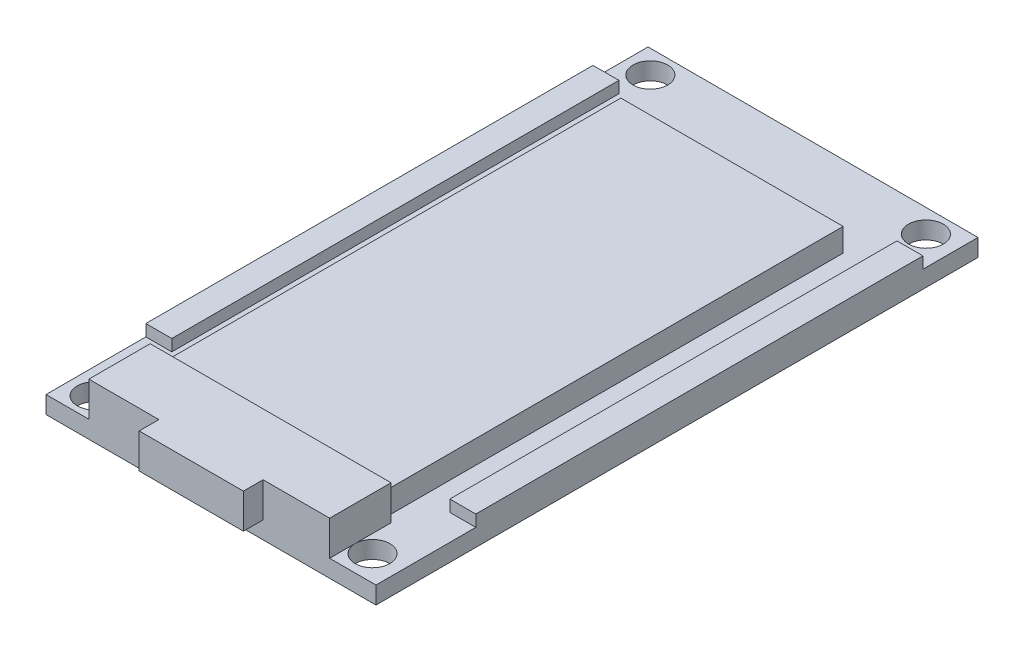
ISO-10303-21;
HEADER;
FILE_DESCRIPTION(('STEP AP214'),'2;1');
FILE_NAME('part.step','',(''),(''),'','','');
FILE_SCHEMA(('AUTOMOTIVE_DESIGN { 1 0 10303 214 1 1 1 1 }'));
ENDSEC;
DATA;
#1=APPLICATION_CONTEXT('core data for automotive mechanical design processes');
#2=APPLICATION_PROTOCOL_DEFINITION('international standard','automotive_design',2000,#1);
#3=PRODUCT_CONTEXT('',#1,'mechanical');
#4=PRODUCT('Part','Part','',(#3));
#5=PRODUCT_RELATED_PRODUCT_CATEGORY('part','',(#4));
#6=PRODUCT_DEFINITION_FORMATION('','',#4);
#7=PRODUCT_DEFINITION_CONTEXT('part definition',#1,'design');
#8=PRODUCT_DEFINITION('design','',#6,#7);
#9=PRODUCT_DEFINITION_SHAPE('','',#8);
#10=(LENGTH_UNIT() NAMED_UNIT(*) SI_UNIT(.MILLI.,.METRE.));
#11=(NAMED_UNIT(*) PLANE_ANGLE_UNIT() SI_UNIT($,.RADIAN.));
#12=(NAMED_UNIT(*) SI_UNIT($,.STERADIAN.) SOLID_ANGLE_UNIT());
#13=UNCERTAINTY_MEASURE_WITH_UNIT(LENGTH_MEASURE(1.E-05),#10,'distance_accuracy_value','');
#14=(GEOMETRIC_REPRESENTATION_CONTEXT(3) GLOBAL_UNCERTAINTY_ASSIGNED_CONTEXT((#13)) GLOBAL_UNIT_ASSIGNED_CONTEXT((#10,
#11,#12)) REPRESENTATION_CONTEXT('',''));
#15=CARTESIAN_POINT('',(0.,0.,0.));
#16=DIRECTION('',(0.,0.,1.));
#17=DIRECTION('',(1.,0.,0.));
#18=AXIS2_PLACEMENT_3D('',#15,#16,#17);
#19=CARTESIAN_POINT('',(0.,1.5,0.));
#20=DIRECTION('',(0.,1.,0.));
#21=DIRECTION('',(0.,0.,1.));
#22=AXIS2_PLACEMENT_3D('',#19,#20,#21);
#23=PLANE('',#22);
#24=DIRECTION('',(-1.,0.,0.));
#25=VECTOR('',#24,1.);
#26=CARTESIAN_POINT('',(2.24290401980517,1.5,43.3778084250648));
#27=LINE('',#26,#25);
#28=CARTESIAN_POINT('',(2.24290401980517,1.5,43.3778084250648));
#29=VERTEX_POINT('',#28);
#30=CARTESIAN_POINT('',(0.,1.5,43.3778084250648));
#31=VERTEX_POINT('',#30);
#32=EDGE_CURVE('E259',#29,#31,#27,.T.);
#33=ORIENTED_EDGE('',*,*,#32,.T.);
#34=DIRECTION('',(0.,0.,1.));
#35=VECTOR('',#34,1.);
#36=CARTESIAN_POINT('',(0.,1.5,0.));
#37=LINE('',#36,#35);
#38=CARTESIAN_POINT('',(0.,1.5,52.));
#39=VERTEX_POINT('',#38);
#40=EDGE_CURVE('E247',#31,#39,#37,.T.);
#41=ORIENTED_EDGE('',*,*,#40,.T.);
#42=DIRECTION('',(1.,0.,0.));
#43=VECTOR('',#42,1.);
#44=CARTESIAN_POINT('',(0.,1.5,52.));
#45=LINE('',#44,#43);
#46=CARTESIAN_POINT('',(3.7,1.5,52.));
#47=VERTEX_POINT('',#46);
#48=EDGE_CURVE('E428',#39,#47,#45,.T.);
#49=ORIENTED_EDGE('',*,*,#48,.T.);
#50=DIRECTION('',(0.,0.,1.));
#51=VECTOR('',#50,1.);
#52=CARTESIAN_POINT('',(3.7,1.5,46.7));
#53=LINE('',#52,#51);
#54=CARTESIAN_POINT('',(3.7,1.5,50.));
#55=VERTEX_POINT('',#54);
#56=EDGE_CURVE('E357',#55,#47,#53,.T.);
#57=ORIENTED_EDGE('',*,*,#56,.F.);
#58=CARTESIAN_POINT('',(2.2,1.5,50.));
#59=DIRECTION('',(0.,1.,0.));
#60=DIRECTION('',(0.,0.,-1.));
#61=AXIS2_PLACEMENT_3D('',#58,#59,#60);
#62=CIRCLE('',#61,1.5);
#63=EDGE_CURVE('E403',#55,#55,#62,.T.);
#64=ORIENTED_EDGE('',*,*,#63,.F.);
#65=CARTESIAN_POINT('',(3.7,1.5,46.7));
#66=VERTEX_POINT('',#65);
#67=EDGE_CURVE('E354',#66,#55,#53,.T.);
#68=ORIENTED_EDGE('',*,*,#67,.F.);
#69=DIRECTION('',(1.,0.,0.));
#70=VECTOR('',#69,1.);
#71=CARTESIAN_POINT('',(9.75,1.5,46.7));
#72=LINE('',#71,#70);
#73=CARTESIAN_POINT('',(4.65,1.5,46.7));
#74=VERTEX_POINT('',#73);
#75=EDGE_CURVE('E386',#66,#74,#72,.T.);
#76=ORIENTED_EDGE('',*,*,#75,.T.);
#77=DIRECTION('',(0.,0.,-1.));
#78=VECTOR('',#77,1.);
#79=CARTESIAN_POINT('',(4.65,1.5,46.7));
#80=LINE('',#79,#78);
#81=CARTESIAN_POINT('',(4.65,1.5,7.));
#82=VERTEX_POINT('',#81);
#83=EDGE_CURVE('E332',#74,#82,#80,.T.);
#84=ORIENTED_EDGE('',*,*,#83,.T.);
#85=DIRECTION('',(1.,0.,0.));
#86=VECTOR('',#85,1.);
#87=CARTESIAN_POINT('',(4.65,1.5,7.));
#88=LINE('',#87,#86);
#89=CARTESIAN_POINT('',(23.85,1.5,7.));
#90=VERTEX_POINT('',#89);
#91=EDGE_CURVE('E322',#82,#90,#88,.T.);
#92=ORIENTED_EDGE('',*,*,#91,.T.);
#93=DIRECTION('',(0.,0.,1.));
#94=VECTOR('',#93,1.);
#95=CARTESIAN_POINT('',(23.85,1.5,7.));
#96=LINE('',#95,#94);
#97=CARTESIAN_POINT('',(23.85,1.5,46.7));
#98=VERTEX_POINT('',#97);
#99=EDGE_CURVE('E317',#90,#98,#96,.T.);
#100=ORIENTED_EDGE('',*,*,#99,.T.);
#101=CARTESIAN_POINT('',(24.5,1.5,46.7));
#102=VERTEX_POINT('',#101);
#103=EDGE_CURVE('E82',#98,#102,#72,.T.);
#104=ORIENTED_EDGE('',*,*,#103,.T.);
#105=DIRECTION('',(0.,0.,-1.));
#106=VECTOR('',#105,1.);
#107=CARTESIAN_POINT('',(24.5,1.5,52.));
#108=LINE('',#107,#106);
#109=CARTESIAN_POINT('',(24.5,1.5,49.8));
#110=VERTEX_POINT('',#109);
#111=EDGE_CURVE('E356',#110,#102,#108,.T.);
#112=ORIENTED_EDGE('',*,*,#111,.F.);
#113=CARTESIAN_POINT('',(26.,1.5,49.8));
#114=DIRECTION('',(0.,1.,0.));
#115=DIRECTION('',(0.,0.,1.));
#116=AXIS2_PLACEMENT_3D('',#113,#114,#115);
#117=CIRCLE('',#116,1.5);
#118=EDGE_CURVE('E415',#110,#110,#117,.T.);
#119=ORIENTED_EDGE('',*,*,#118,.F.);
#120=CARTESIAN_POINT('',(24.5,1.5,52.));
#121=VERTEX_POINT('',#120);
#122=EDGE_CURVE('E365',#121,#110,#108,.T.);
#123=ORIENTED_EDGE('',*,*,#122,.F.);
#124=CARTESIAN_POINT('',(28.5,1.5,52.));
#125=VERTEX_POINT('',#124);
#126=EDGE_CURVE('E427',#121,#125,#45,.T.);
#127=ORIENTED_EDGE('',*,*,#126,.T.);
#128=DIRECTION('',(0.,0.,-1.));
#129=VECTOR('',#128,1.);
#130=CARTESIAN_POINT('',(28.5,1.5,0.));
#131=LINE('',#130,#129);
#132=CARTESIAN_POINT('',(28.5,1.5,43.3778084250648));
#133=VERTEX_POINT('',#132);
#134=EDGE_CURVE('E432',#125,#133,#131,.T.);
#135=ORIENTED_EDGE('',*,*,#134,.T.);
#136=DIRECTION('',(1.,0.,0.));
#137=VECTOR('',#136,1.);
#138=CARTESIAN_POINT('',(1.34198346334804E-13,1.5,43.3778084250649));
#139=LINE('',#138,#137);
#140=CARTESIAN_POINT('',(26.2570959801948,1.5,43.3778084250648));
#141=VERTEX_POINT('',#140);
#142=EDGE_CURVE('E292',#141,#133,#139,.T.);
#143=ORIENTED_EDGE('',*,*,#142,.F.);
#144=DIRECTION('',(0.,0.,1.));
#145=VECTOR('',#144,1.);
#146=CARTESIAN_POINT('',(26.2570959801948,1.5,0.));
#147=LINE('',#146,#145);
#148=CARTESIAN_POINT('',(26.2570959801948,1.5,4.75716758743066));
#149=VERTEX_POINT('',#148);
#150=EDGE_CURVE('E301',#149,#141,#147,.T.);
#151=ORIENTED_EDGE('',*,*,#150,.F.);
#152=DIRECTION('',(-1.,0.,0.));
#153=VECTOR('',#152,1.);
#154=CARTESIAN_POINT('',(0.,1.5,4.75716758743066));
#155=LINE('',#154,#153);
#156=CARTESIAN_POINT('',(28.5,1.5,4.75716758743066));
#157=VERTEX_POINT('',#156);
#158=EDGE_CURVE('E262',#157,#149,#155,.T.);
#159=ORIENTED_EDGE('',*,*,#158,.F.);
#160=CARTESIAN_POINT('',(28.5,1.5,0.));
#161=VERTEX_POINT('',#160);
#162=EDGE_CURVE('E430',#157,#161,#131,.T.);
#163=ORIENTED_EDGE('',*,*,#162,.T.);
#164=DIRECTION('',(-1.,0.,0.));
#165=VECTOR('',#164,1.);
#166=CARTESIAN_POINT('',(0.,1.5,0.));
#167=LINE('',#166,#165);
#168=CARTESIAN_POINT('',(0.,1.5,0.));
#169=VERTEX_POINT('',#168);
#170=EDGE_CURVE('E434',#161,#169,#167,.T.);
#171=ORIENTED_EDGE('',*,*,#170,.T.);
#172=CARTESIAN_POINT('',(0.,1.5,4.75716758743066));
#173=VERTEX_POINT('',#172);
#174=EDGE_CURVE('E255',#169,#173,#37,.T.);
#175=ORIENTED_EDGE('',*,*,#174,.T.);
#176=DIRECTION('',(1.,0.,0.));
#177=VECTOR('',#176,1.);
#178=CARTESIAN_POINT('',(0.,1.5,4.75716758743066));
#179=LINE('',#178,#177);
#180=CARTESIAN_POINT('',(2.24290401980517,1.5,4.75716758743066));
#181=VERTEX_POINT('',#180);
#182=EDGE_CURVE('E101',#173,#181,#179,.T.);
#183=ORIENTED_EDGE('',*,*,#182,.T.);
#184=DIRECTION('',(0.,0.,1.));
#185=VECTOR('',#184,1.);
#186=CARTESIAN_POINT('',(2.24290401980517,1.5,4.75716758743066));
#187=LINE('',#186,#185);
#188=EDGE_CURVE('E96',#181,#29,#187,.T.);
#189=ORIENTED_EDGE('',*,*,#188,.T.);
#190=EDGE_LOOP('',(#33,#41,#49,#57,#64,#68,#76,#84,#92,#100,#104,#112,#119,#123,#127,#135,#143,
#151,#159,#163,#171,#175,#183,#189));
#191=FACE_BOUND('',#190,.T.);
#192=CARTESIAN_POINT('',(2.2,1.5,2.));
#193=DIRECTION('',(0.,1.,0.));
#194=DIRECTION('',(0.,0.,1.));
#195=AXIS2_PLACEMENT_3D('',#192,#193,#194);
#196=CIRCLE('',#195,1.5);
#197=CARTESIAN_POINT('',(2.2,1.5,3.5));
#198=VERTEX_POINT('',#197);
#199=EDGE_CURVE('E409',#198,#198,#196,.T.);
#200=ORIENTED_EDGE('',*,*,#199,.F.);
#201=EDGE_LOOP('',(#200));
#202=FACE_BOUND('',#201,.T.);
#203=CARTESIAN_POINT('',(26.,1.5,2.));
#204=DIRECTION('',(0.,1.,0.));
#205=DIRECTION('',(0.,0.,1.));
#206=AXIS2_PLACEMENT_3D('',#203,#204,#205);
#207=CIRCLE('',#206,1.5);
#208=CARTESIAN_POINT('',(26.,1.5,3.5));
#209=VERTEX_POINT('',#208);
#210=EDGE_CURVE('E421',#209,#209,#207,.T.);
#211=ORIENTED_EDGE('',*,*,#210,.F.);
#212=EDGE_LOOP('',(#211));
#213=FACE_BOUND('',#212,.T.);
#214=ADVANCED_FACE('F78',(#191,#202,#213),#23,.T.);
#215=CARTESIAN_POINT('',(9.75,1.5,46.7));
#216=DIRECTION('',(1.,0.,0.));
#217=DIRECTION('',(0.,0.,-1.));
#218=AXIS2_PLACEMENT_3D('',#215,#216,#217);
#219=PLANE('',#218);
#220=DIRECTION('',(0.,-1.,0.));
#221=VECTOR('',#220,1.);
#222=CARTESIAN_POINT('',(9.75,4.5,52.));
#223=LINE('',#222,#221);
#224=CARTESIAN_POINT('',(9.75,4.5,52.));
#225=VERTEX_POINT('',#224);
#226=CARTESIAN_POINT('',(9.75,1.5,52.));
#227=VERTEX_POINT('',#226);
#228=EDGE_CURVE('E338',#225,#227,#223,.T.);
#229=ORIENTED_EDGE('',*,*,#228,.T.);
#230=DIRECTION('',(0.,0.,-1.));
#231=VECTOR('',#230,1.);
#232=CARTESIAN_POINT('',(9.75,1.5,46.7));
#233=LINE('',#232,#231);
#234=CARTESIAN_POINT('',(9.75,1.5,53.7));
#235=VERTEX_POINT('',#234);
#236=EDGE_CURVE('E379',#235,#227,#233,.T.);
#237=ORIENTED_EDGE('',*,*,#236,.F.);
#238=DIRECTION('',(0.,1.,0.));
#239=VECTOR('',#238,1.);
#240=CARTESIAN_POINT('',(9.75,1.5,53.7));
#241=LINE('',#240,#239);
#242=CARTESIAN_POINT('',(9.75,4.5,53.7));
#243=VERTEX_POINT('',#242);
#244=EDGE_CURVE('E383',#235,#243,#241,.T.);
#245=ORIENTED_EDGE('',*,*,#244,.T.);
#246=DIRECTION('',(0.,0.,-1.));
#247=VECTOR('',#246,1.);
#248=CARTESIAN_POINT('',(9.75,4.5,46.7));
#249=LINE('',#248,#247);
#250=EDGE_CURVE('E378',#243,#225,#249,.T.);
#251=ORIENTED_EDGE('',*,*,#250,.T.);
#252=EDGE_LOOP('',(#229,#237,#245,#251));
#253=FACE_BOUND('',#252,.T.);
#254=ADVANCED_FACE('F472',(#253),#219,.F.);
#255=CARTESIAN_POINT('',(18.75,1.5,46.7));
#256=DIRECTION('',(-1.,0.,0.));
#257=DIRECTION('',(0.,0.,1.));
#258=AXIS2_PLACEMENT_3D('',#255,#256,#257);
#259=PLANE('',#258);
#260=DIRECTION('',(0.,-1.,0.));
#261=VECTOR('',#260,1.);
#262=CARTESIAN_POINT('',(18.75,4.5,52.));
#263=LINE('',#262,#261);
#264=CARTESIAN_POINT('',(18.75,4.5,52.));
#265=VERTEX_POINT('',#264);
#266=CARTESIAN_POINT('',(18.75,1.5,52.));
#267=VERTEX_POINT('',#266);
#268=EDGE_CURVE('E372',#265,#267,#263,.T.);
#269=ORIENTED_EDGE('',*,*,#268,.F.);
#270=DIRECTION('',(0.,0.,1.));
#271=VECTOR('',#270,1.);
#272=CARTESIAN_POINT('',(18.75,4.5,46.7));
#273=LINE('',#272,#271);
#274=CARTESIAN_POINT('',(18.75,4.5,53.7));
#275=VERTEX_POINT('',#274);
#276=EDGE_CURVE('E400',#265,#275,#273,.T.);
#277=ORIENTED_EDGE('',*,*,#276,.T.);
#278=DIRECTION('',(0.,1.,0.));
#279=VECTOR('',#278,1.);
#280=CARTESIAN_POINT('',(18.75,1.5,53.7));
#281=LINE('',#280,#279);
#282=CARTESIAN_POINT('',(18.75,1.5,53.7));
#283=VERTEX_POINT('',#282);
#284=EDGE_CURVE('E456',#283,#275,#281,.T.);
#285=ORIENTED_EDGE('',*,*,#284,.F.);
#286=DIRECTION('',(0.,0.,1.));
#287=VECTOR('',#286,1.);
#288=CARTESIAN_POINT('',(18.75,1.5,46.7));
#289=LINE('',#288,#287);
#290=EDGE_CURVE('E396',#267,#283,#289,.T.);
#291=ORIENTED_EDGE('',*,*,#290,.F.);
#292=EDGE_LOOP('',(#269,#277,#285,#291));
#293=FACE_BOUND('',#292,.T.);
#294=ADVANCED_FACE('F540',(#293),#259,.F.);
#295=CARTESIAN_POINT('',(0.,0.,0.));
#296=DIRECTION('',(0.,1.,0.));
#297=DIRECTION('',(0.,0.,1.));
#298=AXIS2_PLACEMENT_3D('',#295,#296,#297);
#299=PLANE('',#298);
#300=DIRECTION('',(0.,0.,1.));
#301=VECTOR('',#300,1.);
#302=CARTESIAN_POINT('',(0.,0.,0.));
#303=LINE('',#302,#301);
#304=CARTESIAN_POINT('',(0.,0.,0.));
#305=VERTEX_POINT('',#304);
#306=CARTESIAN_POINT('',(0.,0.,52.));
#307=VERTEX_POINT('',#306);
#308=EDGE_CURVE('E424',#305,#307,#303,.T.);
#309=ORIENTED_EDGE('',*,*,#308,.F.);
#310=DIRECTION('',(-1.,0.,0.));
#311=VECTOR('',#310,1.);
#312=CARTESIAN_POINT('',(0.,0.,0.));
#313=LINE('',#312,#311);
#314=CARTESIAN_POINT('',(28.5,0.,0.));
#315=VERTEX_POINT('',#314);
#316=EDGE_CURVE('E256',#315,#305,#313,.T.);
#317=ORIENTED_EDGE('',*,*,#316,.F.);
#318=DIRECTION('',(0.,0.,-1.));
#319=VECTOR('',#318,1.);
#320=CARTESIAN_POINT('',(28.5,0.,0.));
#321=LINE('',#320,#319);
#322=CARTESIAN_POINT('',(28.5,0.,52.));
#323=VERTEX_POINT('',#322);
#324=EDGE_CURVE('E440',#323,#315,#321,.T.);
#325=ORIENTED_EDGE('',*,*,#324,.F.);
#326=DIRECTION('',(1.,0.,0.));
#327=VECTOR('',#326,1.);
#328=CARTESIAN_POINT('',(0.,0.,52.));
#329=LINE('',#328,#327);
#330=EDGE_CURVE('E438',#307,#323,#329,.T.);
#331=ORIENTED_EDGE('',*,*,#330,.F.);
#332=EDGE_LOOP('',(#309,#317,#325,#331));
#333=FACE_BOUND('',#332,.T.);
#334=CARTESIAN_POINT('',(26.,0.,2.));
#335=DIRECTION('',(0.,1.,0.));
#336=DIRECTION('',(0.,0.,1.));
#337=AXIS2_PLACEMENT_3D('',#334,#335,#336);
#338=CIRCLE('',#337,1.5);
#339=CARTESIAN_POINT('',(26.,0.,3.5));
#340=VERTEX_POINT('',#339);
#341=EDGE_CURVE('E418',#340,#340,#338,.T.);
#342=ORIENTED_EDGE('',*,*,#341,.T.);
#343=EDGE_LOOP('',(#342));
#344=FACE_BOUND('',#343,.T.);
#345=CARTESIAN_POINT('',(26.,0.,49.8));
#346=DIRECTION('',(0.,1.,0.));
#347=DIRECTION('',(0.,0.,1.));
#348=AXIS2_PLACEMENT_3D('',#345,#346,#347);
#349=CIRCLE('',#348,1.5);
#350=CARTESIAN_POINT('',(26.,0.,51.3));
#351=VERTEX_POINT('',#350);
#352=EDGE_CURVE('E412',#351,#351,#349,.T.);
#353=ORIENTED_EDGE('',*,*,#352,.T.);
#354=EDGE_LOOP('',(#353));
#355=FACE_BOUND('',#354,.T.);
#356=CARTESIAN_POINT('',(2.2,0.,2.));
#357=DIRECTION('',(0.,1.,0.));
#358=DIRECTION('',(0.,0.,1.));
#359=AXIS2_PLACEMENT_3D('',#356,#357,#358);
#360=CIRCLE('',#359,1.5);
#361=CARTESIAN_POINT('',(2.2,0.,3.5));
#362=VERTEX_POINT('',#361);
#363=EDGE_CURVE('E406',#362,#362,#360,.T.);
#364=ORIENTED_EDGE('',*,*,#363,.T.);
#365=EDGE_LOOP('',(#364));
#366=FACE_BOUND('',#365,.T.);
#367=CARTESIAN_POINT('',(2.2,0.,50.));
#368=DIRECTION('',(0.,1.,0.));
#369=DIRECTION('',(0.,0.,-1.));
#370=AXIS2_PLACEMENT_3D('',#367,#368,#369);
#371=CIRCLE('',#370,1.5);
#372=CARTESIAN_POINT('',(2.2,0.,48.5));
#373=VERTEX_POINT('',#372);
#374=EDGE_CURVE('E388',#373,#373,#371,.T.);
#375=ORIENTED_EDGE('',*,*,#374,.T.);
#376=EDGE_LOOP('',(#375));
#377=FACE_BOUND('',#376,.T.);
#378=ADVANCED_FACE('F546',(#333,#344,#355,#366,#377),#299,.F.);
#379=CARTESIAN_POINT('',(0.,1.5,0.));
#380=DIRECTION('',(1.,0.,0.));
#381=DIRECTION('',(0.,0.,-1.));
#382=AXIS2_PLACEMENT_3D('',#379,#380,#381);
#383=PLANE('',#382);
#384=ORIENTED_EDGE('',*,*,#308,.T.);
#385=DIRECTION('',(0.,-1.,0.));
#386=VECTOR('',#385,1.);
#387=CARTESIAN_POINT('',(0.,1.5,52.));
#388=LINE('',#387,#386);
#389=EDGE_CURVE('E12',#39,#307,#388,.T.);
#390=ORIENTED_EDGE('',*,*,#389,.F.);
#391=ORIENTED_EDGE('',*,*,#40,.F.);
#392=DIRECTION('',(0.,-1.,0.));
#393=VECTOR('',#392,1.);
#394=CARTESIAN_POINT('',(0.,2.5,43.3778084250648));
#395=LINE('',#394,#393);
#396=CARTESIAN_POINT('',(0.,2.5,43.3778084250648));
#397=VERTEX_POINT('',#396);
#398=EDGE_CURVE('E251',#397,#31,#395,.T.);
#399=ORIENTED_EDGE('',*,*,#398,.F.);
#400=DIRECTION('',(0.,0.,-1.));
#401=VECTOR('',#400,1.);
#402=CARTESIAN_POINT('',(0.,2.5,43.3778084250648));
#403=LINE('',#402,#401);
#404=CARTESIAN_POINT('',(0.,2.5,4.75716758743066));
#405=VERTEX_POINT('',#404);
#406=EDGE_CURVE('E285',#397,#405,#403,.T.);
#407=ORIENTED_EDGE('',*,*,#406,.T.);
#408=DIRECTION('',(0.,-1.,0.));
#409=VECTOR('',#408,1.);
#410=CARTESIAN_POINT('',(0.,2.5,4.75716758743066));
#411=LINE('',#410,#409);
#412=EDGE_CURVE('E269',#405,#173,#411,.T.);
#413=ORIENTED_EDGE('',*,*,#412,.T.);
#414=ORIENTED_EDGE('',*,*,#174,.F.);
#415=DIRECTION('',(0.,-1.,0.));
#416=VECTOR('',#415,1.);
#417=CARTESIAN_POINT('',(0.,1.5,0.));
#418=LINE('',#417,#416);
#419=EDGE_CURVE('E436',#169,#305,#418,.T.);
#420=ORIENTED_EDGE('',*,*,#419,.T.);
#421=EDGE_LOOP('',(#384,#390,#391,#399,#407,#413,#414,#420));
#422=FACE_BOUND('',#421,.T.);
#423=ADVANCED_FACE('F80',(#422),#383,.F.);
#424=CARTESIAN_POINT('',(0.,1.5,52.));
#425=DIRECTION('',(0.,0.,-1.));
#426=DIRECTION('',(-1.,0.,0.));
#427=AXIS2_PLACEMENT_3D('',#424,#425,#426);
#428=PLANE('',#427);
#429=ORIENTED_EDGE('',*,*,#330,.T.);
#430=DIRECTION('',(0.,-1.,0.));
#431=VECTOR('',#430,1.);
#432=CARTESIAN_POINT('',(28.5,1.5,52.));
#433=LINE('',#432,#431);
#434=EDGE_CURVE('E88',#125,#323,#433,.T.);
#435=ORIENTED_EDGE('',*,*,#434,.F.);
#436=ORIENTED_EDGE('',*,*,#126,.F.);
#437=DIRECTION('',(0.,-1.,0.));
#438=VECTOR('',#437,1.);
#439=CARTESIAN_POINT('',(24.5,4.5,52.));
#440=LINE('',#439,#438);
#441=CARTESIAN_POINT('',(24.5,4.5,52.));
#442=VERTEX_POINT('',#441);
#443=EDGE_CURVE('E367',#442,#121,#440,.T.);
#444=ORIENTED_EDGE('',*,*,#443,.F.);
#445=DIRECTION('',(1.,0.,0.));
#446=VECTOR('',#445,1.);
#447=CARTESIAN_POINT('',(18.75,4.5,52.));
#448=LINE('',#447,#446);
#449=EDGE_CURVE('E364',#265,#442,#448,.T.);
#450=ORIENTED_EDGE('',*,*,#449,.F.);
#451=ORIENTED_EDGE('',*,*,#268,.T.);
#452=EDGE_CURVE('E431',#227,#267,#45,.T.);
#453=ORIENTED_EDGE('',*,*,#452,.F.);
#454=ORIENTED_EDGE('',*,*,#228,.F.);
#455=DIRECTION('',(1.,0.,0.));
#456=VECTOR('',#455,1.);
#457=CARTESIAN_POINT('',(3.7,4.5,52.));
#458=LINE('',#457,#456);
#459=CARTESIAN_POINT('',(3.7,4.5,52.));
#460=VERTEX_POINT('',#459);
#461=EDGE_CURVE('E359',#460,#225,#458,.T.);
#462=ORIENTED_EDGE('',*,*,#461,.F.);
#463=DIRECTION('',(0.,-1.,0.));
#464=VECTOR('',#463,1.);
#465=CARTESIAN_POINT('',(3.7,4.5,52.));
#466=LINE('',#465,#464);
#467=EDGE_CURVE('E350',#460,#47,#466,.T.);
#468=ORIENTED_EDGE('',*,*,#467,.T.);
#469=ORIENTED_EDGE('',*,*,#48,.F.);
#470=ORIENTED_EDGE('',*,*,#389,.T.);
#471=EDGE_LOOP('',(#429,#435,#436,#444,#450,#451,#453,#454,#462,#468,#469,#470));
#472=FACE_BOUND('',#471,.T.);
#473=ADVANCED_FACE('F483',(#472),#428,.F.);
#474=CARTESIAN_POINT('',(28.5,1.5,0.));
#475=DIRECTION('',(-1.,0.,0.));
#476=DIRECTION('',(0.,0.,1.));
#477=AXIS2_PLACEMENT_3D('',#474,#475,#476);
#478=PLANE('',#477);
#479=ORIENTED_EDGE('',*,*,#324,.T.);
#480=DIRECTION('',(0.,-1.,0.));
#481=VECTOR('',#480,1.);
#482=CARTESIAN_POINT('',(28.5,1.5,0.));
#483=LINE('',#482,#481);
#484=EDGE_CURVE('E445',#161,#315,#483,.T.);
#485=ORIENTED_EDGE('',*,*,#484,.F.);
#486=ORIENTED_EDGE('',*,*,#162,.F.);
#487=DIRECTION('',(0.,-1.,0.));
#488=VECTOR('',#487,1.);
#489=CARTESIAN_POINT('',(28.5,2.5,4.75716758743066));
#490=LINE('',#489,#488);
#491=CARTESIAN_POINT('',(28.5,2.5,4.75716758743066));
#492=VERTEX_POINT('',#491);
#493=EDGE_CURVE('E314',#492,#157,#490,.T.);
#494=ORIENTED_EDGE('',*,*,#493,.F.);
#495=DIRECTION('',(0.,0.,-1.));
#496=VECTOR('',#495,1.);
#497=CARTESIAN_POINT('',(28.5,2.5,0.));
#498=LINE('',#497,#496);
#499=CARTESIAN_POINT('',(28.5,2.5,43.3778084250648));
#500=VERTEX_POINT('',#499);
#501=EDGE_CURVE('E288',#500,#492,#498,.T.);
#502=ORIENTED_EDGE('',*,*,#501,.F.);
#503=DIRECTION('',(0.,-1.,0.));
#504=VECTOR('',#503,1.);
#505=CARTESIAN_POINT('',(28.5,2.5,43.3778084250648));
#506=LINE('',#505,#504);
#507=EDGE_CURVE('E298',#500,#133,#506,.T.);
#508=ORIENTED_EDGE('',*,*,#507,.T.);
#509=ORIENTED_EDGE('',*,*,#134,.F.);
#510=ORIENTED_EDGE('',*,*,#434,.T.);
#511=EDGE_LOOP('',(#479,#485,#486,#494,#502,#508,#509,#510));
#512=FACE_BOUND('',#511,.T.);
#513=ADVANCED_FACE('F494',(#512),#478,.F.);
#514=CARTESIAN_POINT('',(0.,1.5,0.));
#515=DIRECTION('',(0.,0.,1.));
#516=DIRECTION('',(1.,0.,0.));
#517=AXIS2_PLACEMENT_3D('',#514,#515,#516);
#518=PLANE('',#517);
#519=ORIENTED_EDGE('',*,*,#316,.T.);
#520=ORIENTED_EDGE('',*,*,#419,.F.);
#521=ORIENTED_EDGE('',*,*,#170,.F.);
#522=ORIENTED_EDGE('',*,*,#484,.T.);
#523=EDGE_LOOP('',(#519,#520,#521,#522));
#524=FACE_BOUND('',#523,.T.);
#525=ADVANCED_FACE('F514',(#524),#518,.F.);
#526=CARTESIAN_POINT('',(26.,1.5,2.));
#527=DIRECTION('',(0.,-1.,0.));
#528=DIRECTION('',(0.,0.,-1.));
#529=AXIS2_PLACEMENT_3D('',#526,#527,#528);
#530=CYLINDRICAL_SURFACE('',#529,1.5);
#531=ORIENTED_EDGE('',*,*,#210,.T.);
#532=EDGE_LOOP('',(#531));
#533=FACE_BOUND('',#532,.T.);
#534=ORIENTED_EDGE('',*,*,#341,.F.);
#535=EDGE_LOOP('',(#534));
#536=FACE_BOUND('',#535,.T.);
#537=ADVANCED_FACE('F544',(#533,#536),#530,.F.);
#538=CARTESIAN_POINT('',(26.,1.5,49.8));
#539=DIRECTION('',(0.,-1.,0.));
#540=DIRECTION('',(0.,0.,-1.));
#541=AXIS2_PLACEMENT_3D('',#538,#539,#540);
#542=CYLINDRICAL_SURFACE('',#541,1.5);
#543=ORIENTED_EDGE('',*,*,#118,.T.);
#544=EDGE_LOOP('',(#543));
#545=FACE_BOUND('',#544,.T.);
#546=ORIENTED_EDGE('',*,*,#352,.F.);
#547=EDGE_LOOP('',(#546));
#548=FACE_BOUND('',#547,.T.);
#549=ADVANCED_FACE('F749',(#545,#548),#542,.F.);
#550=CARTESIAN_POINT('',(2.2,1.5,2.));
#551=DIRECTION('',(0.,-1.,0.));
#552=DIRECTION('',(0.,0.,-1.));
#553=AXIS2_PLACEMENT_3D('',#550,#551,#552);
#554=CYLINDRICAL_SURFACE('',#553,1.5);
#555=ORIENTED_EDGE('',*,*,#199,.T.);
#556=EDGE_LOOP('',(#555));
#557=FACE_BOUND('',#556,.T.);
#558=ORIENTED_EDGE('',*,*,#363,.F.);
#559=EDGE_LOOP('',(#558));
#560=FACE_BOUND('',#559,.T.);
#561=ADVANCED_FACE('F740',(#557,#560),#554,.F.);
#562=CARTESIAN_POINT('',(2.2,1.5,50.));
#563=DIRECTION('',(0.,-1.,0.));
#564=DIRECTION('',(0.,0.,-1.));
#565=AXIS2_PLACEMENT_3D('',#562,#563,#564);
#566=CYLINDRICAL_SURFACE('',#565,1.5);
#567=ORIENTED_EDGE('',*,*,#63,.T.);
#568=EDGE_LOOP('',(#567));
#569=FACE_BOUND('',#568,.T.);
#570=ORIENTED_EDGE('',*,*,#374,.F.);
#571=EDGE_LOOP('',(#570));
#572=FACE_BOUND('',#571,.T.);
#573=ADVANCED_FACE('F709',(#569,#572),#566,.F.);
#574=CARTESIAN_POINT('',(0.,4.5,0.));
#575=DIRECTION('',(0.,-1.,0.));
#576=DIRECTION('',(0.,0.,-1.));
#577=AXIS2_PLACEMENT_3D('',#574,#575,#576);
#578=PLANE('',#577);
#579=ORIENTED_EDGE('',*,*,#250,.F.);
#580=DIRECTION('',(-1.,0.,0.));
#581=VECTOR('',#580,1.);
#582=CARTESIAN_POINT('',(9.75,4.5,53.7));
#583=LINE('',#582,#581);
#584=EDGE_CURVE('E382',#275,#243,#583,.T.);
#585=ORIENTED_EDGE('',*,*,#584,.F.);
#586=ORIENTED_EDGE('',*,*,#276,.F.);
#587=ORIENTED_EDGE('',*,*,#449,.T.);
#588=DIRECTION('',(0.,0.,-1.));
#589=VECTOR('',#588,1.);
#590=CARTESIAN_POINT('',(24.5,4.5,52.));
#591=LINE('',#590,#589);
#592=CARTESIAN_POINT('',(24.5,4.5,46.7));
#593=VERTEX_POINT('',#592);
#594=EDGE_CURVE('E361',#442,#593,#591,.T.);
#595=ORIENTED_EDGE('',*,*,#594,.T.);
#596=DIRECTION('',(1.,0.,0.));
#597=VECTOR('',#596,1.);
#598=CARTESIAN_POINT('',(9.75,4.5,46.7));
#599=LINE('',#598,#597);
#600=CARTESIAN_POINT('',(3.7,4.5,46.7));
#601=VERTEX_POINT('',#600);
#602=EDGE_CURVE('E399',#601,#593,#599,.T.);
#603=ORIENTED_EDGE('',*,*,#602,.F.);
#604=DIRECTION('',(0.,0.,1.));
#605=VECTOR('',#604,1.);
#606=CARTESIAN_POINT('',(3.7,4.5,46.7));
#607=LINE('',#606,#605);
#608=EDGE_CURVE('E353',#601,#460,#607,.T.);
#609=ORIENTED_EDGE('',*,*,#608,.T.);
#610=ORIENTED_EDGE('',*,*,#461,.T.);
#611=EDGE_LOOP('',(#579,#585,#586,#587,#595,#603,#609,#610));
#612=FACE_BOUND('',#611,.T.);
#613=ADVANCED_FACE('F476',(#612),#578,.F.);
#614=CARTESIAN_POINT('',(0.,1.5,0.));
#615=DIRECTION('',(0.,-1.,0.));
#616=DIRECTION('',(0.,0.,-1.));
#617=AXIS2_PLACEMENT_3D('',#614,#615,#616);
#618=PLANE('',#617);
#619=ORIENTED_EDGE('',*,*,#236,.T.);
#620=ORIENTED_EDGE('',*,*,#452,.T.);
#621=ORIENTED_EDGE('',*,*,#290,.T.);
#622=DIRECTION('',(-1.,0.,0.));
#623=VECTOR('',#622,1.);
#624=CARTESIAN_POINT('',(9.75,1.5,53.7));
#625=LINE('',#624,#623);
#626=EDGE_CURVE('E450',#283,#235,#625,.T.);
#627=ORIENTED_EDGE('',*,*,#626,.T.);
#628=EDGE_LOOP('',(#619,#620,#621,#627));
#629=FACE_BOUND('',#628,.T.);
#630=ADVANCED_FACE('F716',(#629),#618,.T.);
#631=CARTESIAN_POINT('',(9.75,1.5,53.7));
#632=DIRECTION('',(0.,0.,-1.));
#633=DIRECTION('',(-1.,0.,0.));
#634=AXIS2_PLACEMENT_3D('',#631,#632,#633);
#635=PLANE('',#634);
#636=ORIENTED_EDGE('',*,*,#584,.T.);
#637=ORIENTED_EDGE('',*,*,#244,.F.);
#638=ORIENTED_EDGE('',*,*,#626,.F.);
#639=ORIENTED_EDGE('',*,*,#284,.T.);
#640=EDGE_LOOP('',(#636,#637,#638,#639));
#641=FACE_BOUND('',#640,.T.);
#642=ADVANCED_FACE('F706',(#641),#635,.F.);
#643=CARTESIAN_POINT('',(9.75,1.5,46.7));
#644=DIRECTION('',(0.,0.,1.));
#645=DIRECTION('',(1.,0.,0.));
#646=AXIS2_PLACEMENT_3D('',#643,#644,#645);
#647=PLANE('',#646);
#648=ORIENTED_EDGE('',*,*,#103,.F.);
#649=DIRECTION('',(0.,-1.,0.));
#650=VECTOR('',#649,1.);
#651=CARTESIAN_POINT('',(23.85,3.5,46.7));
#652=LINE('',#651,#650);
#653=CARTESIAN_POINT('',(23.85,3.5,46.7));
#654=VERTEX_POINT('',#653);
#655=EDGE_CURVE('E330',#654,#98,#652,.T.);
#656=ORIENTED_EDGE('',*,*,#655,.F.);
#657=DIRECTION('',(-1.,0.,0.));
#658=VECTOR('',#657,1.);
#659=CARTESIAN_POINT('',(23.85,3.5,46.7));
#660=LINE('',#659,#658);
#661=CARTESIAN_POINT('',(4.65,3.5,46.7));
#662=VERTEX_POINT('',#661);
#663=EDGE_CURVE('E321',#654,#662,#660,.T.);
#664=ORIENTED_EDGE('',*,*,#663,.T.);
#665=DIRECTION('',(0.,-1.,0.));
#666=VECTOR('',#665,1.);
#667=CARTESIAN_POINT('',(4.65,3.5,46.7));
#668=LINE('',#667,#666);
#669=EDGE_CURVE('E342',#662,#74,#668,.T.);
#670=ORIENTED_EDGE('',*,*,#669,.T.);
#671=ORIENTED_EDGE('',*,*,#75,.F.);
#672=DIRECTION('',(0.,-1.,0.));
#673=VECTOR('',#672,1.);
#674=CARTESIAN_POINT('',(3.7,4.5,46.7));
#675=LINE('',#674,#673);
#676=EDGE_CURVE('E347',#601,#66,#675,.T.);
#677=ORIENTED_EDGE('',*,*,#676,.F.);
#678=ORIENTED_EDGE('',*,*,#602,.T.);
#679=DIRECTION('',(0.,-1.,0.));
#680=VECTOR('',#679,1.);
#681=CARTESIAN_POINT('',(24.5,4.5,46.7));
#682=LINE('',#681,#680);
#683=EDGE_CURVE('E375',#593,#102,#682,.T.);
#684=ORIENTED_EDGE('',*,*,#683,.T.);
#685=EDGE_LOOP('',(#648,#656,#664,#670,#671,#677,#678,#684));
#686=FACE_BOUND('',#685,.T.);
#687=ADVANCED_FACE('F680',(#686),#647,.F.);
#688=CARTESIAN_POINT('',(24.5,4.5,52.));
#689=DIRECTION('',(-1.,0.,0.));
#690=DIRECTION('',(0.,0.,1.));
#691=AXIS2_PLACEMENT_3D('',#688,#689,#690);
#692=PLANE('',#691);
#693=ORIENTED_EDGE('',*,*,#122,.T.);
#694=ORIENTED_EDGE('',*,*,#111,.T.);
#695=ORIENTED_EDGE('',*,*,#683,.F.);
#696=ORIENTED_EDGE('',*,*,#594,.F.);
#697=ORIENTED_EDGE('',*,*,#443,.T.);
#698=EDGE_LOOP('',(#693,#694,#695,#696,#697));
#699=FACE_BOUND('',#698,.T.);
#700=ADVANCED_FACE('F671',(#699),#692,.F.);
#701=CARTESIAN_POINT('',(3.7,4.5,46.7));
#702=DIRECTION('',(1.,0.,0.));
#703=DIRECTION('',(0.,0.,-1.));
#704=AXIS2_PLACEMENT_3D('',#701,#702,#703);
#705=PLANE('',#704);
#706=ORIENTED_EDGE('',*,*,#67,.T.);
#707=ORIENTED_EDGE('',*,*,#56,.T.);
#708=ORIENTED_EDGE('',*,*,#467,.F.);
#709=ORIENTED_EDGE('',*,*,#608,.F.);
#710=ORIENTED_EDGE('',*,*,#676,.T.);
#711=EDGE_LOOP('',(#706,#707,#708,#709,#710));
#712=FACE_BOUND('',#711,.T.);
#713=ADVANCED_FACE('F662',(#712),#705,.F.);
#714=CARTESIAN_POINT('',(23.85,3.5,7.));
#715=DIRECTION('',(1.,0.,0.));
#716=DIRECTION('',(0.,0.,-1.));
#717=AXIS2_PLACEMENT_3D('',#714,#715,#716);
#718=PLANE('',#717);
#719=ORIENTED_EDGE('',*,*,#99,.F.);
#720=DIRECTION('',(0.,-1.,0.));
#721=VECTOR('',#720,1.);
#722=CARTESIAN_POINT('',(23.85,3.5,7.));
#723=LINE('',#722,#721);
#724=CARTESIAN_POINT('',(23.85,3.5,7.));
#725=VERTEX_POINT('',#724);
#726=EDGE_CURVE('E335',#725,#90,#723,.T.);
#727=ORIENTED_EDGE('',*,*,#726,.F.);
#728=DIRECTION('',(0.,0.,1.));
#729=VECTOR('',#728,1.);
#730=CARTESIAN_POINT('',(23.85,3.5,7.));
#731=LINE('',#730,#729);
#732=EDGE_CURVE('E318',#725,#654,#731,.T.);
#733=ORIENTED_EDGE('',*,*,#732,.T.);
#734=ORIENTED_EDGE('',*,*,#655,.T.);
#735=EDGE_LOOP('',(#719,#727,#733,#734));
#736=FACE_BOUND('',#735,.T.);
#737=ADVANCED_FACE('F653',(#736),#718,.T.);
#738=CARTESIAN_POINT('',(4.65,3.5,7.));
#739=DIRECTION('',(0.,0.,-1.));
#740=DIRECTION('',(-1.,0.,0.));
#741=AXIS2_PLACEMENT_3D('',#738,#739,#740);
#742=PLANE('',#741);
#743=ORIENTED_EDGE('',*,*,#91,.F.);
#744=DIRECTION('',(0.,-1.,0.));
#745=VECTOR('',#744,1.);
#746=CARTESIAN_POINT('',(4.65,3.5,7.));
#747=LINE('',#746,#745);
#748=CARTESIAN_POINT('',(4.65,3.5,7.));
#749=VERTEX_POINT('',#748);
#750=EDGE_CURVE('E339',#749,#82,#747,.T.);
#751=ORIENTED_EDGE('',*,*,#750,.F.);
#752=DIRECTION('',(1.,0.,0.));
#753=VECTOR('',#752,1.);
#754=CARTESIAN_POINT('',(4.65,3.5,7.));
#755=LINE('',#754,#753);
#756=EDGE_CURVE('E327',#749,#725,#755,.T.);
#757=ORIENTED_EDGE('',*,*,#756,.T.);
#758=ORIENTED_EDGE('',*,*,#726,.T.);
#759=EDGE_LOOP('',(#743,#751,#757,#758));
#760=FACE_BOUND('',#759,.T.);
#761=ADVANCED_FACE('F644',(#760),#742,.T.);
#762=CARTESIAN_POINT('',(4.65,3.5,46.7));
#763=DIRECTION('',(-1.,0.,0.));
#764=DIRECTION('',(0.,0.,1.));
#765=AXIS2_PLACEMENT_3D('',#762,#763,#764);
#766=PLANE('',#765);
#767=ORIENTED_EDGE('',*,*,#83,.F.);
#768=ORIENTED_EDGE('',*,*,#669,.F.);
#769=DIRECTION('',(0.,0.,-1.));
#770=VECTOR('',#769,1.);
#771=CARTESIAN_POINT('',(4.65,3.5,46.7));
#772=LINE('',#771,#770);
#773=EDGE_CURVE('E324',#662,#749,#772,.T.);
#774=ORIENTED_EDGE('',*,*,#773,.T.);
#775=ORIENTED_EDGE('',*,*,#750,.T.);
#776=EDGE_LOOP('',(#767,#768,#774,#775));
#777=FACE_BOUND('',#776,.T.);
#778=ADVANCED_FACE('F635',(#777),#766,.T.);
#779=CARTESIAN_POINT('',(0.,3.5,0.));
#780=DIRECTION('',(0.,-1.,0.));
#781=DIRECTION('',(0.,0.,-1.));
#782=AXIS2_PLACEMENT_3D('',#779,#780,#781);
#783=PLANE('',#782);
#784=ORIENTED_EDGE('',*,*,#732,.F.);
#785=ORIENTED_EDGE('',*,*,#756,.F.);
#786=ORIENTED_EDGE('',*,*,#773,.F.);
#787=ORIENTED_EDGE('',*,*,#663,.F.);
#788=EDGE_LOOP('',(#784,#785,#786,#787));
#789=FACE_BOUND('',#788,.T.);
#790=ADVANCED_FACE('F572',(#789),#783,.F.);
#791=CARTESIAN_POINT('',(0.,2.5,4.75716758743066));
#792=DIRECTION('',(0.,0.,1.));
#793=DIRECTION('',(1.,0.,0.));
#794=AXIS2_PLACEMENT_3D('',#791,#792,#793);
#795=PLANE('',#794);
#796=ORIENTED_EDGE('',*,*,#158,.T.);
#797=DIRECTION('',(0.,-1.,0.));
#798=VECTOR('',#797,1.);
#799=CARTESIAN_POINT('',(26.2570959801948,2.5,4.75716758743066));
#800=LINE('',#799,#798);
#801=CARTESIAN_POINT('',(26.2570959801948,2.5,4.75716758743066));
#802=VERTEX_POINT('',#801);
#803=EDGE_CURVE('E311',#802,#149,#800,.T.);
#804=ORIENTED_EDGE('',*,*,#803,.F.);
#805=DIRECTION('',(-1.,0.,0.));
#806=VECTOR('',#805,1.);
#807=CARTESIAN_POINT('',(0.,2.5,4.75716758743066));
#808=LINE('',#807,#806);
#809=EDGE_CURVE('E291',#492,#802,#808,.T.);
#810=ORIENTED_EDGE('',*,*,#809,.F.);
#811=ORIENTED_EDGE('',*,*,#493,.T.);
#812=EDGE_LOOP('',(#796,#804,#810,#811));
#813=FACE_BOUND('',#812,.T.);
#814=ADVANCED_FACE('F508',(#813),#795,.F.);
#815=CARTESIAN_POINT('',(26.2570959801948,2.5,0.));
#816=DIRECTION('',(1.,0.,0.));
#817=DIRECTION('',(0.,0.,-1.));
#818=AXIS2_PLACEMENT_3D('',#815,#816,#817);
#819=PLANE('',#818);
#820=ORIENTED_EDGE('',*,*,#150,.T.);
#821=DIRECTION('',(0.,-1.,0.));
#822=VECTOR('',#821,1.);
#823=CARTESIAN_POINT('',(26.2570959801948,2.5,43.3778084250648));
#824=LINE('',#823,#822);
#825=CARTESIAN_POINT('',(26.2570959801948,2.5,43.3778084250648));
#826=VERTEX_POINT('',#825);
#827=EDGE_CURVE('E308',#826,#141,#824,.T.);
#828=ORIENTED_EDGE('',*,*,#827,.F.);
#829=DIRECTION('',(0.,0.,1.));
#830=VECTOR('',#829,1.);
#831=CARTESIAN_POINT('',(26.2570959801948,2.5,0.));
#832=LINE('',#831,#830);
#833=EDGE_CURVE('E294',#802,#826,#832,.T.);
#834=ORIENTED_EDGE('',*,*,#833,.F.);
#835=ORIENTED_EDGE('',*,*,#803,.T.);
#836=EDGE_LOOP('',(#820,#828,#834,#835));
#837=FACE_BOUND('',#836,.T.);
#838=ADVANCED_FACE('F504',(#837),#819,.F.);
#839=CARTESIAN_POINT('',(1.34198346334804E-13,2.5,43.3778084250649));
#840=DIRECTION('',(0.,0.,-1.));
#841=DIRECTION('',(-1.,0.,0.));
#842=AXIS2_PLACEMENT_3D('',#839,#840,#841);
#843=PLANE('',#842);
#844=ORIENTED_EDGE('',*,*,#142,.T.);
#845=ORIENTED_EDGE('',*,*,#507,.F.);
#846=DIRECTION('',(1.,0.,0.));
#847=VECTOR('',#846,1.);
#848=CARTESIAN_POINT('',(1.34198346334804E-13,2.5,43.3778084250649));
#849=LINE('',#848,#847);
#850=EDGE_CURVE('E296',#826,#500,#849,.T.);
#851=ORIENTED_EDGE('',*,*,#850,.F.);
#852=ORIENTED_EDGE('',*,*,#827,.T.);
#853=EDGE_LOOP('',(#844,#845,#851,#852));
#854=FACE_BOUND('',#853,.T.);
#855=ADVANCED_FACE('F500',(#854),#843,.F.);
#856=CARTESIAN_POINT('',(0.,2.5,0.));
#857=DIRECTION('',(0.,1.,0.));
#858=DIRECTION('',(0.,0.,1.));
#859=AXIS2_PLACEMENT_3D('',#856,#857,#858);
#860=PLANE('',#859);
#861=ORIENTED_EDGE('',*,*,#501,.T.);
#862=ORIENTED_EDGE('',*,*,#809,.T.);
#863=ORIENTED_EDGE('',*,*,#833,.T.);
#864=ORIENTED_EDGE('',*,*,#850,.T.);
#865=EDGE_LOOP('',(#861,#862,#863,#864));
#866=FACE_BOUND('',#865,.T.);
#867=ADVANCED_FACE('F587',(#866),#860,.T.);
#868=CARTESIAN_POINT('',(2.24290401980517,2.5,43.3778084250648));
#869=DIRECTION('',(0.,0.,1.));
#870=DIRECTION('',(1.,0.,0.));
#871=AXIS2_PLACEMENT_3D('',#868,#869,#870);
#872=PLANE('',#871);
#873=ORIENTED_EDGE('',*,*,#32,.F.);
#874=DIRECTION('',(0.,-1.,0.));
#875=VECTOR('',#874,1.);
#876=CARTESIAN_POINT('',(2.24290401980517,2.5,43.3778084250648));
#877=LINE('',#876,#875);
#878=CARTESIAN_POINT('',(2.24290401980517,2.5,43.3778084250648));
#879=VERTEX_POINT('',#878);
#880=EDGE_CURVE('E279',#879,#29,#877,.T.);
#881=ORIENTED_EDGE('',*,*,#880,.F.);
#882=DIRECTION('',(-1.,0.,0.));
#883=VECTOR('',#882,1.);
#884=CARTESIAN_POINT('',(2.24290401980517,2.5,43.3778084250648));
#885=LINE('',#884,#883);
#886=EDGE_CURVE('E267',#879,#397,#885,.T.);
#887=ORIENTED_EDGE('',*,*,#886,.T.);
#888=ORIENTED_EDGE('',*,*,#398,.T.);
#889=EDGE_LOOP('',(#873,#881,#887,#888));
#890=FACE_BOUND('',#889,.T.);
#891=ADVANCED_FACE('F265',(#890),#872,.T.);
#892=CARTESIAN_POINT('',(2.24290401980517,2.5,4.75716758743066));
#893=DIRECTION('',(1.,0.,0.));
#894=DIRECTION('',(0.,0.,-1.));
#895=AXIS2_PLACEMENT_3D('',#892,#893,#894);
#896=PLANE('',#895);
#897=ORIENTED_EDGE('',*,*,#188,.F.);
#898=DIRECTION('',(0.,-1.,0.));
#899=VECTOR('',#898,1.);
#900=CARTESIAN_POINT('',(2.24290401980517,2.5,4.75716758743066));
#901=LINE('',#900,#899);
#902=CARTESIAN_POINT('',(2.24290401980517,2.5,4.75716758743066));
#903=VERTEX_POINT('',#902);
#904=EDGE_CURVE('E275',#903,#181,#901,.T.);
#905=ORIENTED_EDGE('',*,*,#904,.F.);
#906=DIRECTION('',(0.,0.,1.));
#907=VECTOR('',#906,1.);
#908=CARTESIAN_POINT('',(2.24290401980517,2.5,4.75716758743066));
#909=LINE('',#908,#907);
#910=EDGE_CURVE('E268',#903,#879,#909,.T.);
#911=ORIENTED_EDGE('',*,*,#910,.T.);
#912=ORIENTED_EDGE('',*,*,#880,.T.);
#913=EDGE_LOOP('',(#897,#905,#911,#912));
#914=FACE_BOUND('',#913,.T.);
#915=ADVANCED_FACE('F522',(#914),#896,.T.);
#916=CARTESIAN_POINT('',(0.,2.5,4.75716758743066));
#917=DIRECTION('',(0.,0.,-1.));
#918=DIRECTION('',(-1.,0.,0.));
#919=AXIS2_PLACEMENT_3D('',#916,#917,#918);
#920=PLANE('',#919);
#921=ORIENTED_EDGE('',*,*,#182,.F.);
#922=ORIENTED_EDGE('',*,*,#412,.F.);
#923=DIRECTION('',(1.,0.,0.));
#924=VECTOR('',#923,1.);
#925=CARTESIAN_POINT('',(0.,2.5,4.75716758743066));
#926=LINE('',#925,#924);
#927=EDGE_CURVE('E272',#405,#903,#926,.T.);
#928=ORIENTED_EDGE('',*,*,#927,.T.);
#929=ORIENTED_EDGE('',*,*,#904,.T.);
#930=EDGE_LOOP('',(#921,#922,#928,#929));
#931=FACE_BOUND('',#930,.T.);
#932=ADVANCED_FACE('F519',(#931),#920,.T.);
#933=CARTESIAN_POINT('',(0.,2.5,0.));
#934=DIRECTION('',(0.,-1.,0.));
#935=DIRECTION('',(0.,0.,-1.));
#936=AXIS2_PLACEMENT_3D('',#933,#934,#935);
#937=PLANE('',#936);
#938=ORIENTED_EDGE('',*,*,#886,.F.);
#939=ORIENTED_EDGE('',*,*,#910,.F.);
#940=ORIENTED_EDGE('',*,*,#927,.F.);
#941=ORIENTED_EDGE('',*,*,#406,.F.);
#942=EDGE_LOOP('',(#938,#939,#940,#941));
#943=FACE_BOUND('',#942,.T.);
#944=ADVANCED_FACE('F524',(#943),#937,.F.);
#945=CLOSED_SHELL('',(#214,#254,#294,#378,#423,#473,#513,#525,#537,#549,#561,#573,#613,#630,
#642,#687,#700,#713,#737,#761,#778,#790,#814,#838,#855,#867,#891,#915,#932,#944));
#946=MANIFOLD_SOLID_BREP('B2',#945);
#947=ADVANCED_BREP_SHAPE_REPRESENTATION('',(#18,#946),#14);
#948=SHAPE_DEFINITION_REPRESENTATION(#9,#947);
ENDSEC;
END-ISO-10303-21;
